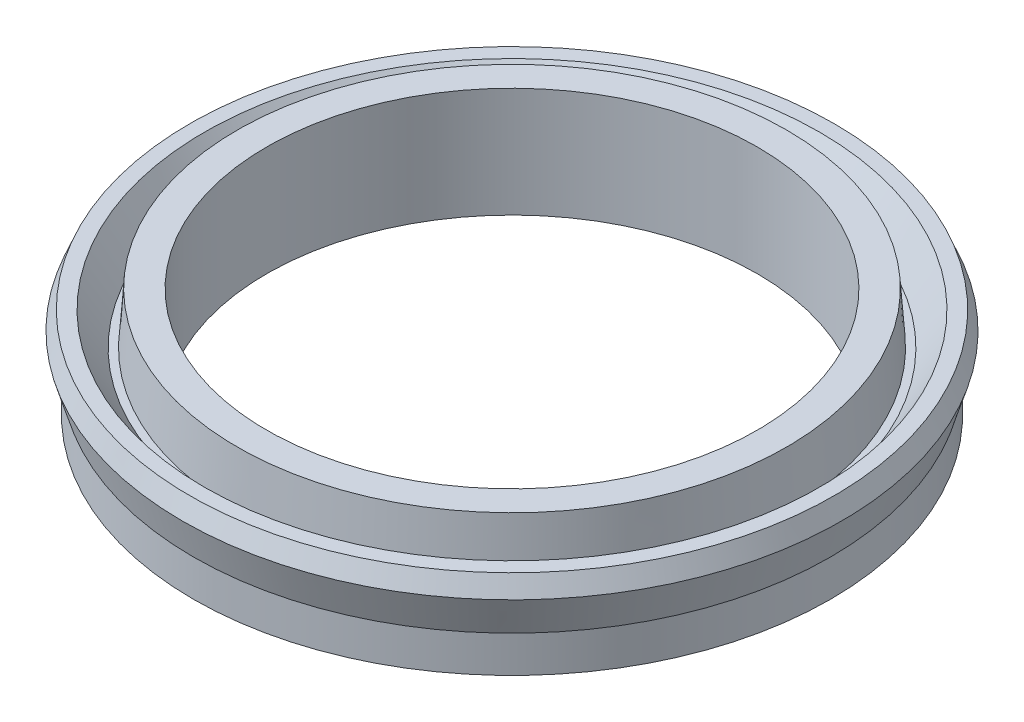
ISO-10303-21;
HEADER;
FILE_DESCRIPTION(('STEP AP214'),'2;1');
FILE_NAME('part.step','',(''),(''),'','','');
FILE_SCHEMA(('AUTOMOTIVE_DESIGN { 1 0 10303 214 1 1 1 1 }'));
ENDSEC;
DATA;
#1=APPLICATION_CONTEXT('core data for automotive mechanical design processes');
#2=APPLICATION_PROTOCOL_DEFINITION('international standard','automotive_design',2000,#1);
#3=PRODUCT_CONTEXT('',#1,'mechanical');
#4=PRODUCT('Part','Part','',(#3));
#5=PRODUCT_RELATED_PRODUCT_CATEGORY('part','',(#4));
#6=PRODUCT_DEFINITION_FORMATION('','',#4);
#7=PRODUCT_DEFINITION_CONTEXT('part definition',#1,'design');
#8=PRODUCT_DEFINITION('design','',#6,#7);
#9=PRODUCT_DEFINITION_SHAPE('','',#8);
#10=(LENGTH_UNIT() NAMED_UNIT(*) SI_UNIT(.MILLI.,.METRE.));
#11=(NAMED_UNIT(*) PLANE_ANGLE_UNIT() SI_UNIT($,.RADIAN.));
#12=(NAMED_UNIT(*) SI_UNIT($,.STERADIAN.) SOLID_ANGLE_UNIT());
#13=UNCERTAINTY_MEASURE_WITH_UNIT(LENGTH_MEASURE(1.E-05),#10,'distance_accuracy_value','');
#14=(GEOMETRIC_REPRESENTATION_CONTEXT(3) GLOBAL_UNCERTAINTY_ASSIGNED_CONTEXT((#13)) GLOBAL_UNIT_ASSIGNED_CONTEXT((#10,
#11,#12)) REPRESENTATION_CONTEXT('',''));
#15=CARTESIAN_POINT('',(0.,0.,0.));
#16=DIRECTION('',(0.,0.,1.));
#17=DIRECTION('',(1.,0.,0.));
#18=AXIS2_PLACEMENT_3D('',#15,#16,#17);
#19=CARTESIAN_POINT('',(8.7,0.,0.));
#20=DIRECTION('',(0.,-1.,0.));
#21=DIRECTION('',(0.,0.,-1.));
#22=AXIS2_PLACEMENT_3D('',#19,#20,#21);
#23=PLANE('',#22);
#24=CARTESIAN_POINT('',(0.,0.,0.));
#25=DIRECTION('',(0.,-1.,0.));
#26=DIRECTION('',(0.,0.,-1.));
#27=AXIS2_PLACEMENT_3D('',#24,#25,#26);
#28=CIRCLE('',#27,8.7);
#29=CARTESIAN_POINT('',(0.,0.,-8.7));
#30=VERTEX_POINT('',#29);
#31=EDGE_CURVE('E65',#30,#30,#28,.T.);
#32=ORIENTED_EDGE('',*,*,#31,.T.);
#33=EDGE_LOOP('',(#32));
#34=FACE_BOUND('',#33,.T.);
#35=CARTESIAN_POINT('',(0.,0.,0.));
#36=DIRECTION('',(0.,-1.,0.));
#37=DIRECTION('',(0.,0.,-1.));
#38=AXIS2_PLACEMENT_3D('',#35,#36,#37);
#39=CIRCLE('',#38,6.7);
#40=CARTESIAN_POINT('',(0.,0.,-6.7));
#41=VERTEX_POINT('',#40);
#42=EDGE_CURVE('E10',#41,#41,#39,.T.);
#43=ORIENTED_EDGE('',*,*,#42,.F.);
#44=EDGE_LOOP('',(#43));
#45=FACE_BOUND('',#44,.T.);
#46=ADVANCED_FACE('F31',(#34,#45),#23,.T.);
#47=CARTESIAN_POINT('',(0.,0.,0.));
#48=DIRECTION('',(0.,-1.,0.));
#49=DIRECTION('',(0.,0.,-1.));
#50=AXIS2_PLACEMENT_3D('',#47,#48,#49);
#51=CYLINDRICAL_SURFACE('',#50,6.7);
#52=ORIENTED_EDGE('',*,*,#42,.T.);
#53=EDGE_LOOP('',(#52));
#54=FACE_BOUND('',#53,.T.);
#55=CARTESIAN_POINT('',(0.,3.,0.));
#56=DIRECTION('',(0.,-1.,0.));
#57=DIRECTION('',(0.,0.,-1.));
#58=AXIS2_PLACEMENT_3D('',#55,#56,#57);
#59=CIRCLE('',#58,6.7);
#60=CARTESIAN_POINT('',(0.,3.,-6.7));
#61=VERTEX_POINT('',#60);
#62=EDGE_CURVE('E37',#61,#61,#59,.T.);
#63=ORIENTED_EDGE('',*,*,#62,.F.);
#64=EDGE_LOOP('',(#63));
#65=FACE_BOUND('',#64,.T.);
#66=ADVANCED_FACE('F83',(#54,#65),#51,.F.);
#67=CARTESIAN_POINT('',(6.7,3.,0.));
#68=DIRECTION('',(0.,1.,0.));
#69=DIRECTION('',(0.,0.,1.));
#70=AXIS2_PLACEMENT_3D('',#67,#68,#69);
#71=PLANE('',#70);
#72=ORIENTED_EDGE('',*,*,#62,.T.);
#73=EDGE_LOOP('',(#72));
#74=FACE_BOUND('',#73,.T.);
#75=CARTESIAN_POINT('',(0.,3.,0.));
#76=DIRECTION('',(0.,-1.,0.));
#77=DIRECTION('',(0.,0.,-1.));
#78=AXIS2_PLACEMENT_3D('',#75,#76,#77);
#79=CIRCLE('',#78,7.5);
#80=CARTESIAN_POINT('',(0.,3.,-7.5));
#81=VERTEX_POINT('',#80);
#82=EDGE_CURVE('E41',#81,#81,#79,.T.);
#83=ORIENTED_EDGE('',*,*,#82,.F.);
#84=EDGE_LOOP('',(#83));
#85=FACE_BOUND('',#84,.T.);
#86=ADVANCED_FACE('F87',(#74,#85),#71,.T.);
#87=CARTESIAN_POINT('',(0.,1.6,0.));
#88=DIRECTION('',(0.,-1.,0.));
#89=DIRECTION('',(0.,0.,-1.));
#90=AXIS2_PLACEMENT_3D('',#87,#88,#89);
#91=CONICAL_SURFACE('',#90,7.6,0.0713074647852905);
#92=ORIENTED_EDGE('',*,*,#82,.T.);
#93=EDGE_LOOP('',(#92));
#94=FACE_BOUND('',#93,.T.);
#95=CARTESIAN_POINT('',(0.,1.6,0.));
#96=DIRECTION('',(0.,-1.,0.));
#97=DIRECTION('',(0.,0.,-1.));
#98=AXIS2_PLACEMENT_3D('',#95,#96,#97);
#99=CIRCLE('',#98,7.6);
#100=CARTESIAN_POINT('',(0.,1.6,-7.6));
#101=VERTEX_POINT('',#100);
#102=EDGE_CURVE('E45',#101,#101,#99,.T.);
#103=ORIENTED_EDGE('',*,*,#102,.F.);
#104=EDGE_LOOP('',(#103));
#105=FACE_BOUND('',#104,.T.);
#106=ADVANCED_FACE('F91',(#94,#105),#91,.T.);
#107=CARTESIAN_POINT('',(7.6,1.6,0.));
#108=DIRECTION('',(0.,1.,0.));
#109=DIRECTION('',(0.,0.,1.));
#110=AXIS2_PLACEMENT_3D('',#107,#108,#109);
#111=PLANE('',#110);
#112=ORIENTED_EDGE('',*,*,#102,.T.);
#113=EDGE_LOOP('',(#112));
#114=FACE_BOUND('',#113,.T.);
#115=CARTESIAN_POINT('',(0.,1.6,0.));
#116=DIRECTION('',(0.,-1.,0.));
#117=DIRECTION('',(0.,0.,-1.));
#118=AXIS2_PLACEMENT_3D('',#115,#116,#117);
#119=CIRCLE('',#118,7.8);
#120=CARTESIAN_POINT('',(0.,1.6,-7.8));
#121=VERTEX_POINT('',#120);
#122=EDGE_CURVE('E50',#121,#121,#119,.T.);
#123=ORIENTED_EDGE('',*,*,#122,.F.);
#124=EDGE_LOOP('',(#123));
#125=FACE_BOUND('',#124,.T.);
#126=ADVANCED_FACE('F97',(#114,#125),#111,.T.);
#127=CARTESIAN_POINT('',(0.,2.5,0.));
#128=DIRECTION('',(0.,1.,0.));
#129=DIRECTION('',(0.,0.,1.));
#130=AXIS2_PLACEMENT_3D('',#127,#128,#129);
#131=CONICAL_SURFACE('',#130,8.4,0.588002603547568);
#132=ORIENTED_EDGE('',*,*,#122,.T.);
#133=EDGE_LOOP('',(#132));
#134=FACE_BOUND('',#133,.T.);
#135=CARTESIAN_POINT('',(0.,2.5,0.));
#136=DIRECTION('',(0.,-1.,0.));
#137=DIRECTION('',(0.,0.,-1.));
#138=AXIS2_PLACEMENT_3D('',#135,#136,#137);
#139=CIRCLE('',#138,8.4);
#140=CARTESIAN_POINT('',(0.,2.5,-8.4));
#141=VERTEX_POINT('',#140);
#142=EDGE_CURVE('E53',#141,#141,#139,.T.);
#143=ORIENTED_EDGE('',*,*,#142,.F.);
#144=EDGE_LOOP('',(#143));
#145=FACE_BOUND('',#144,.T.);
#146=ADVANCED_FACE('F101',(#134,#145),#131,.F.);
#147=CARTESIAN_POINT('',(8.4,2.5,0.));
#148=DIRECTION('',(0.,1.,0.));
#149=DIRECTION('',(0.,0.,1.));
#150=AXIS2_PLACEMENT_3D('',#147,#148,#149);
#151=PLANE('',#150);
#152=ORIENTED_EDGE('',*,*,#142,.T.);
#153=EDGE_LOOP('',(#152));
#154=FACE_BOUND('',#153,.T.);
#155=CARTESIAN_POINT('',(0.,2.5,0.));
#156=DIRECTION('',(0.,-1.,0.));
#157=DIRECTION('',(0.,0.,-1.));
#158=AXIS2_PLACEMENT_3D('',#155,#156,#157);
#159=CIRCLE('',#158,8.8);
#160=CARTESIAN_POINT('',(0.,2.5,-8.8));
#161=VERTEX_POINT('',#160);
#162=EDGE_CURVE('E56',#161,#161,#159,.T.);
#163=ORIENTED_EDGE('',*,*,#162,.F.);
#164=EDGE_LOOP('',(#163));
#165=FACE_BOUND('',#164,.T.);
#166=ADVANCED_FACE('F105',(#154,#165),#151,.T.);
#167=CARTESIAN_POINT('',(0.,2.,0.));
#168=DIRECTION('',(0.,-1.,0.));
#169=DIRECTION('',(0.,0.,-1.));
#170=AXIS2_PLACEMENT_3D('',#167,#168,#169);
#171=CONICAL_SURFACE('',#170,9.,0.380506377112366);
#172=ORIENTED_EDGE('',*,*,#162,.T.);
#173=EDGE_LOOP('',(#172));
#174=FACE_BOUND('',#173,.T.);
#175=CARTESIAN_POINT('',(0.,2.,0.));
#176=DIRECTION('',(0.,-1.,0.));
#177=DIRECTION('',(0.,0.,-1.));
#178=AXIS2_PLACEMENT_3D('',#175,#176,#177);
#179=CIRCLE('',#178,9.);
#180=CARTESIAN_POINT('',(0.,2.,-9.));
#181=VERTEX_POINT('',#180);
#182=EDGE_CURVE('E59',#181,#181,#179,.T.);
#183=ORIENTED_EDGE('',*,*,#182,.F.);
#184=EDGE_LOOP('',(#183));
#185=FACE_BOUND('',#184,.T.);
#186=ADVANCED_FACE('F79',(#174,#185),#171,.T.);
#187=CARTESIAN_POINT('',(0.,1.,0.));
#188=DIRECTION('',(0.,1.,0.));
#189=DIRECTION('',(0.,0.,1.));
#190=AXIS2_PLACEMENT_3D('',#187,#188,#189);
#191=CONICAL_SURFACE('',#190,8.7,0.291456794477867);
#192=ORIENTED_EDGE('',*,*,#182,.T.);
#193=EDGE_LOOP('',(#192));
#194=FACE_BOUND('',#193,.T.);
#195=CARTESIAN_POINT('',(0.,1.,0.));
#196=DIRECTION('',(0.,-1.,0.));
#197=DIRECTION('',(0.,0.,-1.));
#198=AXIS2_PLACEMENT_3D('',#195,#196,#197);
#199=CIRCLE('',#198,8.7);
#200=CARTESIAN_POINT('',(0.,1.,-8.7));
#201=VERTEX_POINT('',#200);
#202=EDGE_CURVE('E62',#201,#201,#199,.T.);
#203=ORIENTED_EDGE('',*,*,#202,.F.);
#204=EDGE_LOOP('',(#203));
#205=FACE_BOUND('',#204,.T.);
#206=ADVANCED_FACE('F73',(#194,#205),#191,.T.);
#207=CARTESIAN_POINT('',(0.,0.,0.));
#208=DIRECTION('',(0.,-1.,0.));
#209=DIRECTION('',(0.,0.,-1.));
#210=AXIS2_PLACEMENT_3D('',#207,#208,#209);
#211=CYLINDRICAL_SURFACE('',#210,8.7);
#212=ORIENTED_EDGE('',*,*,#202,.T.);
#213=EDGE_LOOP('',(#212));
#214=FACE_BOUND('',#213,.T.);
#215=ORIENTED_EDGE('',*,*,#31,.F.);
#216=EDGE_LOOP('',(#215));
#217=FACE_BOUND('',#216,.T.);
#218=ADVANCED_FACE('F71',(#214,#217),#211,.T.);
#219=CLOSED_SHELL('',(#46,#66,#86,#106,#126,#146,#166,#186,#206,#218));
#220=MANIFOLD_SOLID_BREP('B2',#219);
#221=ADVANCED_BREP_SHAPE_REPRESENTATION('',(#18,#220),#14);
#222=SHAPE_DEFINITION_REPRESENTATION(#9,#221);
ENDSEC;
END-ISO-10303-21;
